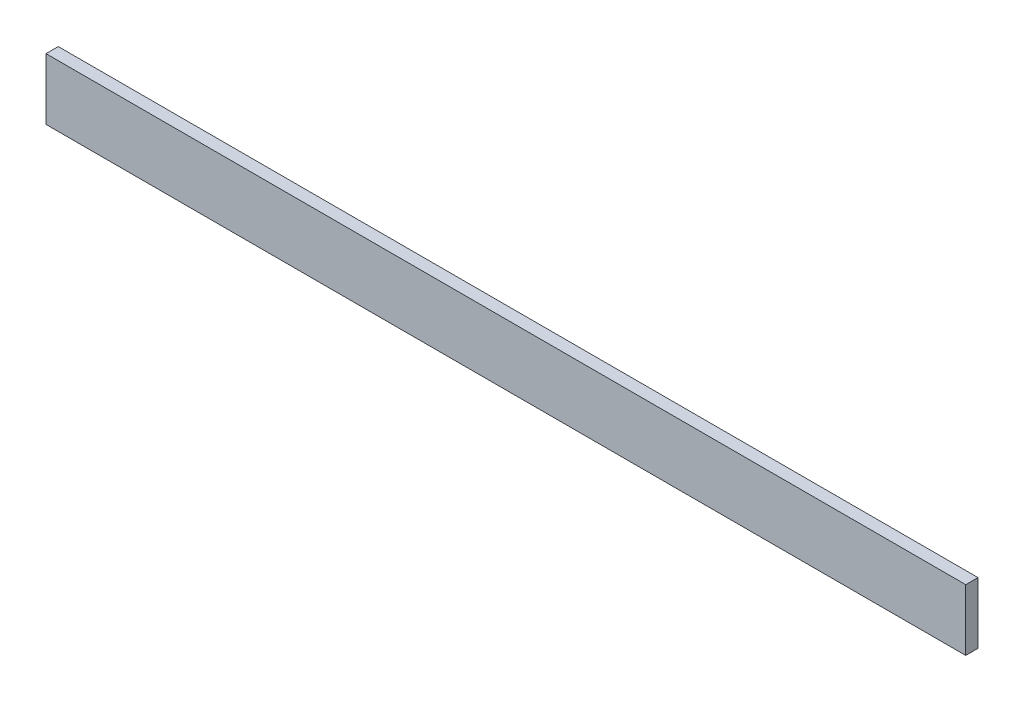
ISO-10303-21;
HEADER;
FILE_DESCRIPTION(('STEP AP214'),'2;1');
FILE_NAME('part.step','',(''),(''),'','','');
FILE_SCHEMA(('AUTOMOTIVE_DESIGN { 1 0 10303 214 1 1 1 1 }'));
ENDSEC;
DATA;
#1=APPLICATION_CONTEXT('core data for automotive mechanical design processes');
#2=APPLICATION_PROTOCOL_DEFINITION('international standard','automotive_design',2000,#1);
#3=PRODUCT_CONTEXT('',#1,'mechanical');
#4=PRODUCT('Part','Part','',(#3));
#5=PRODUCT_RELATED_PRODUCT_CATEGORY('part','',(#4));
#6=PRODUCT_DEFINITION_FORMATION('','',#4);
#7=PRODUCT_DEFINITION_CONTEXT('part definition',#1,'design');
#8=PRODUCT_DEFINITION('design','',#6,#7);
#9=PRODUCT_DEFINITION_SHAPE('','',#8);
#10=(LENGTH_UNIT() NAMED_UNIT(*) SI_UNIT(.MILLI.,.METRE.));
#11=(NAMED_UNIT(*) PLANE_ANGLE_UNIT() SI_UNIT($,.RADIAN.));
#12=(NAMED_UNIT(*) SI_UNIT($,.STERADIAN.) SOLID_ANGLE_UNIT());
#13=UNCERTAINTY_MEASURE_WITH_UNIT(LENGTH_MEASURE(1.E-05),#10,'distance_accuracy_value','');
#14=(GEOMETRIC_REPRESENTATION_CONTEXT(3) GLOBAL_UNCERTAINTY_ASSIGNED_CONTEXT((#13)) GLOBAL_UNIT_ASSIGNED_CONTEXT((#10,
#11,#12)) REPRESENTATION_CONTEXT('',''));
#15=CARTESIAN_POINT('',(0.,0.,0.));
#16=DIRECTION('',(0.,0.,1.));
#17=DIRECTION('',(1.,0.,0.));
#18=AXIS2_PLACEMENT_3D('',#15,#16,#17);
#19=CARTESIAN_POINT('',(0.,5.,1.));
#20=DIRECTION('',(1.,0.,0.));
#21=DIRECTION('',(0.,1.,0.));
#22=AXIS2_PLACEMENT_3D('',#19,#20,#21);
#23=PLANE('',#22);
#24=DIRECTION('',(0.,-1.,0.));
#25=VECTOR('',#24,1.);
#26=CARTESIAN_POINT('',(0.,5.,0.));
#27=LINE('',#26,#25);
#28=CARTESIAN_POINT('',(0.,5.,0.));
#29=VERTEX_POINT('',#28);
#30=CARTESIAN_POINT('',(0.,0.,0.));
#31=VERTEX_POINT('',#30);
#32=EDGE_CURVE('E107',#29,#31,#27,.T.);
#33=ORIENTED_EDGE('',*,*,#32,.T.);
#34=DIRECTION('',(0.,0.,-1.));
#35=VECTOR('',#34,1.);
#36=CARTESIAN_POINT('',(0.,0.,1.));
#37=LINE('',#36,#35);
#38=CARTESIAN_POINT('',(0.,0.,1.));
#39=VERTEX_POINT('',#38);
#40=EDGE_CURVE('E11',#39,#31,#37,.T.);
#41=ORIENTED_EDGE('',*,*,#40,.F.);
#42=DIRECTION('',(0.,-1.,0.));
#43=VECTOR('',#42,1.);
#44=CARTESIAN_POINT('',(0.,5.,1.));
#45=LINE('',#44,#43);
#46=CARTESIAN_POINT('',(0.,5.,1.));
#47=VERTEX_POINT('',#46);
#48=EDGE_CURVE('E91',#47,#39,#45,.T.);
#49=ORIENTED_EDGE('',*,*,#48,.F.);
#50=DIRECTION('',(0.,0.,-1.));
#51=VECTOR('',#50,1.);
#52=CARTESIAN_POINT('',(0.,5.,1.));
#53=LINE('',#52,#51);
#54=EDGE_CURVE('E103',#47,#29,#53,.T.);
#55=ORIENTED_EDGE('',*,*,#54,.T.);
#56=EDGE_LOOP('',(#33,#41,#49,#55));
#57=FACE_BOUND('',#56,.T.);
#58=ADVANCED_FACE('F39',(#57),#23,.F.);
#59=CARTESIAN_POINT('',(0.,0.,1.));
#60=DIRECTION('',(0.,1.,0.));
#61=DIRECTION('',(0.,0.,1.));
#62=AXIS2_PLACEMENT_3D('',#59,#60,#61);
#63=PLANE('',#62);
#64=DIRECTION('',(1.,0.,0.));
#65=VECTOR('',#64,1.);
#66=CARTESIAN_POINT('',(0.,0.,0.));
#67=LINE('',#66,#65);
#68=CARTESIAN_POINT('',(75.,0.,0.));
#69=VERTEX_POINT('',#68);
#70=EDGE_CURVE('E96',#31,#69,#67,.T.);
#71=ORIENTED_EDGE('',*,*,#70,.T.);
#72=DIRECTION('',(0.,0.,-1.));
#73=VECTOR('',#72,1.);
#74=CARTESIAN_POINT('',(75.,0.,1.));
#75=LINE('',#74,#73);
#76=CARTESIAN_POINT('',(75.,0.,1.));
#77=VERTEX_POINT('',#76);
#78=EDGE_CURVE('E48',#77,#69,#75,.T.);
#79=ORIENTED_EDGE('',*,*,#78,.F.);
#80=DIRECTION('',(1.,0.,0.));
#81=VECTOR('',#80,1.);
#82=CARTESIAN_POINT('',(0.,0.,1.));
#83=LINE('',#82,#81);
#84=EDGE_CURVE('E86',#39,#77,#83,.T.);
#85=ORIENTED_EDGE('',*,*,#84,.F.);
#86=ORIENTED_EDGE('',*,*,#40,.T.);
#87=EDGE_LOOP('',(#71,#79,#85,#86));
#88=FACE_BOUND('',#87,.T.);
#89=ADVANCED_FACE('F95',(#88),#63,.F.);
#90=CARTESIAN_POINT('',(75.,0.,1.));
#91=DIRECTION('',(-1.,0.,0.));
#92=DIRECTION('',(0.,0.,1.));
#93=AXIS2_PLACEMENT_3D('',#90,#91,#92);
#94=PLANE('',#93);
#95=DIRECTION('',(0.,1.,0.));
#96=VECTOR('',#95,1.);
#97=CARTESIAN_POINT('',(75.,0.,0.));
#98=LINE('',#97,#96);
#99=CARTESIAN_POINT('',(75.,5.00000000000001,0.));
#100=VERTEX_POINT('',#99);
#101=EDGE_CURVE('E73',#69,#100,#98,.T.);
#102=ORIENTED_EDGE('',*,*,#101,.T.);
#103=DIRECTION('',(0.,0.,-1.));
#104=VECTOR('',#103,1.);
#105=CARTESIAN_POINT('',(75.,5.00000000000001,1.));
#106=LINE('',#105,#104);
#107=CARTESIAN_POINT('',(75.,5.00000000000001,1.));
#108=VERTEX_POINT('',#107);
#109=EDGE_CURVE('E98',#108,#100,#106,.T.);
#110=ORIENTED_EDGE('',*,*,#109,.F.);
#111=DIRECTION('',(0.,1.,0.));
#112=VECTOR('',#111,1.);
#113=CARTESIAN_POINT('',(75.,0.,1.));
#114=LINE('',#113,#112);
#115=EDGE_CURVE('E89',#77,#108,#114,.T.);
#116=ORIENTED_EDGE('',*,*,#115,.F.);
#117=ORIENTED_EDGE('',*,*,#78,.T.);
#118=EDGE_LOOP('',(#102,#110,#116,#117));
#119=FACE_BOUND('',#118,.T.);
#120=ADVANCED_FACE('F99',(#119),#94,.F.);
#121=CARTESIAN_POINT('',(75.,5.00000000000001,1.));
#122=DIRECTION('',(0.,-1.,0.));
#123=DIRECTION('',(1.,0.,0.));
#124=AXIS2_PLACEMENT_3D('',#121,#122,#123);
#125=PLANE('',#124);
#126=DIRECTION('',(-1.,0.,0.));
#127=VECTOR('',#126,1.);
#128=CARTESIAN_POINT('',(75.,5.00000000000001,0.));
#129=LINE('',#128,#127);
#130=EDGE_CURVE('E79',#100,#29,#129,.T.);
#131=ORIENTED_EDGE('',*,*,#130,.T.);
#132=ORIENTED_EDGE('',*,*,#54,.F.);
#133=DIRECTION('',(-1.,0.,0.));
#134=VECTOR('',#133,1.);
#135=CARTESIAN_POINT('',(75.,5.00000000000001,1.));
#136=LINE('',#135,#134);
#137=EDGE_CURVE('E56',#108,#47,#136,.T.);
#138=ORIENTED_EDGE('',*,*,#137,.F.);
#139=ORIENTED_EDGE('',*,*,#109,.T.);
#140=EDGE_LOOP('',(#131,#132,#138,#139));
#141=FACE_BOUND('',#140,.T.);
#142=ADVANCED_FACE('F120',(#141),#125,.F.);
#143=CARTESIAN_POINT('',(0.,0.,1.));
#144=DIRECTION('',(0.,0.,1.));
#145=DIRECTION('',(1.,0.,0.));
#146=AXIS2_PLACEMENT_3D('',#143,#144,#145);
#147=PLANE('',#146);
#148=ORIENTED_EDGE('',*,*,#48,.T.);
#149=ORIENTED_EDGE('',*,*,#84,.T.);
#150=ORIENTED_EDGE('',*,*,#115,.T.);
#151=ORIENTED_EDGE('',*,*,#137,.T.);
#152=EDGE_LOOP('',(#148,#149,#150,#151));
#153=FACE_BOUND('',#152,.T.);
#154=ADVANCED_FACE('F87',(#153),#147,.T.);
#155=CARTESIAN_POINT('',(0.,0.,0.));
#156=DIRECTION('',(0.,0.,1.));
#157=DIRECTION('',(1.,0.,0.));
#158=AXIS2_PLACEMENT_3D('',#155,#156,#157);
#159=PLANE('',#158);
#160=ORIENTED_EDGE('',*,*,#32,.F.);
#161=ORIENTED_EDGE('',*,*,#130,.F.);
#162=ORIENTED_EDGE('',*,*,#101,.F.);
#163=ORIENTED_EDGE('',*,*,#70,.F.);
#164=EDGE_LOOP('',(#160,#161,#162,#163));
#165=FACE_BOUND('',#164,.T.);
#166=ADVANCED_FACE('F123',(#165),#159,.F.);
#167=CLOSED_SHELL('',(#58,#89,#120,#142,#154,#166));
#168=MANIFOLD_SOLID_BREP('B2',#167);
#169=ADVANCED_BREP_SHAPE_REPRESENTATION('',(#18,#168),#14);
#170=SHAPE_DEFINITION_REPRESENTATION(#9,#169);
ENDSEC;
END-ISO-10303-21;
